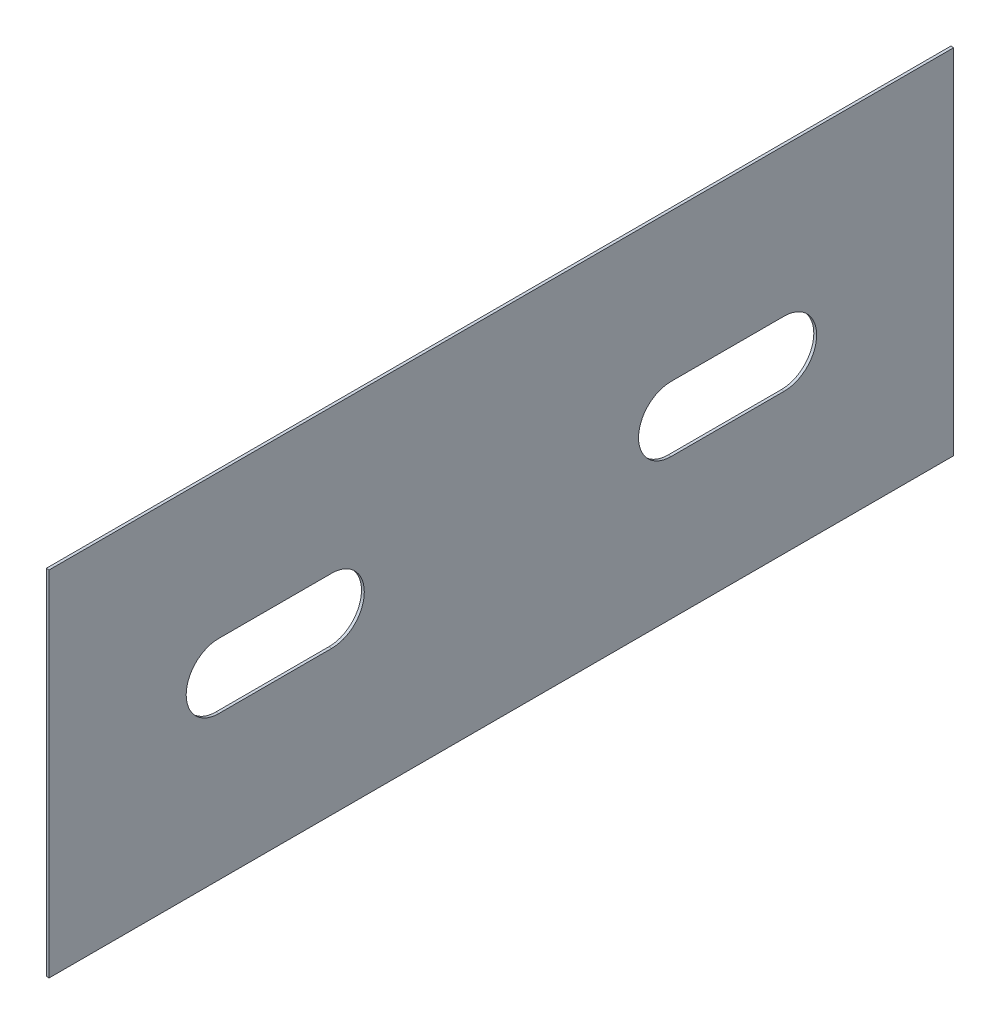
ISO-10303-21;
HEADER;
FILE_DESCRIPTION(('STEP AP214'),'2;1');
FILE_NAME('part.step','',(''),(''),'','','');
FILE_SCHEMA(('AUTOMOTIVE_DESIGN { 1 0 10303 214 1 1 1 1 }'));
ENDSEC;
DATA;
#1=APPLICATION_CONTEXT('core data for automotive mechanical design processes');
#2=APPLICATION_PROTOCOL_DEFINITION('international standard','automotive_design',2000,#1);
#3=PRODUCT_CONTEXT('',#1,'mechanical');
#4=PRODUCT('Part','Part','',(#3));
#5=PRODUCT_RELATED_PRODUCT_CATEGORY('part','',(#4));
#6=PRODUCT_DEFINITION_FORMATION('','',#4);
#7=PRODUCT_DEFINITION_CONTEXT('part definition',#1,'design');
#8=PRODUCT_DEFINITION('design','',#6,#7);
#9=PRODUCT_DEFINITION_SHAPE('','',#8);
#10=(LENGTH_UNIT() NAMED_UNIT(*) SI_UNIT(.MILLI.,.METRE.));
#11=(NAMED_UNIT(*) PLANE_ANGLE_UNIT() SI_UNIT($,.RADIAN.));
#12=(NAMED_UNIT(*) SI_UNIT($,.STERADIAN.) SOLID_ANGLE_UNIT());
#13=UNCERTAINTY_MEASURE_WITH_UNIT(LENGTH_MEASURE(1.E-05),#10,'distance_accuracy_value','');
#14=(GEOMETRIC_REPRESENTATION_CONTEXT(3) GLOBAL_UNCERTAINTY_ASSIGNED_CONTEXT((#13)) GLOBAL_UNIT_ASSIGNED_CONTEXT((#10,
#11,#12)) REPRESENTATION_CONTEXT('',''));
#15=CARTESIAN_POINT('',(0.,0.,0.));
#16=DIRECTION('',(0.,0.,1.));
#17=DIRECTION('',(1.,0.,0.));
#18=AXIS2_PLACEMENT_3D('',#15,#16,#17);
#19=CARTESIAN_POINT('',(2.,0.,0.));
#20=DIRECTION('',(1.,0.,0.));
#21=DIRECTION('',(0.,0.,-1.));
#22=AXIS2_PLACEMENT_3D('',#19,#20,#21);
#23=PLANE('',#22);
#24=DIRECTION('',(0.,-1.,0.));
#25=VECTOR('',#24,1.);
#26=CARTESIAN_POINT('',(2.,135.719844357977,318.75486381323));
#27=LINE('',#26,#25);
#28=CARTESIAN_POINT('',(2.,135.719844357977,318.75486381323));
#29=VERTEX_POINT('',#28);
#30=CARTESIAN_POINT('',(2.,-114.280155642023,318.75486381323));
#31=VERTEX_POINT('',#30);
#32=EDGE_CURVE('E188',#29,#31,#27,.T.);
#33=ORIENTED_EDGE('',*,*,#32,.T.);
#34=DIRECTION('',(0.,0.,-1.));
#35=VECTOR('',#34,1.);
#36=CARTESIAN_POINT('',(2.,-114.280155642023,318.75486381323));
#37=LINE('',#36,#35);
#38=CARTESIAN_POINT('',(2.,-114.280155642023,-321.24513618677));
#39=VERTEX_POINT('',#38);
#40=EDGE_CURVE('E191',#31,#39,#37,.T.);
#41=ORIENTED_EDGE('',*,*,#40,.T.);
#42=DIRECTION('',(0.,1.,0.));
#43=VECTOR('',#42,1.);
#44=CARTESIAN_POINT('',(2.,135.719844357977,-321.24513618677));
#45=LINE('',#44,#43);
#46=CARTESIAN_POINT('',(2.,135.719844357977,-321.24513618677));
#47=VERTEX_POINT('',#46);
#48=EDGE_CURVE('E194',#39,#47,#45,.T.);
#49=ORIENTED_EDGE('',*,*,#48,.T.);
#50=DIRECTION('',(0.,0.,1.));
#51=VECTOR('',#50,1.);
#52=CARTESIAN_POINT('',(2.,135.719844357977,318.75486381323));
#53=LINE('',#52,#51);
#54=EDGE_CURVE('E196',#47,#29,#53,.T.);
#55=ORIENTED_EDGE('',*,*,#54,.T.);
#56=EDGE_LOOP('',(#33,#41,#49,#55));
#57=FACE_BOUND('',#56,.T.);
#58=DIRECTION('',(0.,0.,-1.));
#59=VECTOR('',#58,1.);
#60=CARTESIAN_POINT('',(2.,-12.2801556420232,198.75486381323));
#61=LINE('',#60,#59);
#62=CARTESIAN_POINT('',(2.,-12.2801556420232,198.75486381323));
#63=VERTEX_POINT('',#62);
#64=CARTESIAN_POINT('',(2.,-12.2801556420233,118.75486381323));
#65=VERTEX_POINT('',#64);
#66=EDGE_CURVE('E159',#63,#65,#61,.T.);
#67=ORIENTED_EDGE('',*,*,#66,.F.);
#68=CARTESIAN_POINT('',(2.,10.7198443579767,198.75486381323));
#69=DIRECTION('',(1.,0.,0.));
#70=DIRECTION('',(0.,0.,-1.));
#71=AXIS2_PLACEMENT_3D('',#68,#69,#70);
#72=CIRCLE('',#71,23.);
#73=CARTESIAN_POINT('',(2.,33.7198443579767,198.75486381323));
#74=VERTEX_POINT('',#73);
#75=EDGE_CURVE('E157',#74,#63,#72,.T.);
#76=ORIENTED_EDGE('',*,*,#75,.F.);
#77=DIRECTION('',(0.,0.,1.));
#78=VECTOR('',#77,1.);
#79=CARTESIAN_POINT('',(2.,33.7198443579767,198.75486381323));
#80=LINE('',#79,#78);
#81=CARTESIAN_POINT('',(2.,33.7198443579767,118.75486381323));
#82=VERTEX_POINT('',#81);
#83=EDGE_CURVE('E165',#82,#74,#80,.T.);
#84=ORIENTED_EDGE('',*,*,#83,.F.);
#85=CARTESIAN_POINT('',(2.,10.7198443579767,118.75486381323));
#86=DIRECTION('',(1.,0.,0.));
#87=DIRECTION('',(0.,0.,-1.));
#88=AXIS2_PLACEMENT_3D('',#85,#86,#87);
#89=CIRCLE('',#88,23.);
#90=EDGE_CURVE('E162',#65,#82,#89,.T.);
#91=ORIENTED_EDGE('',*,*,#90,.F.);
#92=EDGE_LOOP('',(#67,#76,#84,#91));
#93=FACE_BOUND('',#92,.T.);
#94=DIRECTION('',(0.,0.,-1.));
#95=VECTOR('',#94,1.);
#96=CARTESIAN_POINT('',(2.,-14.8078155315203,-121.24513618677));
#97=LINE('',#96,#95);
#98=CARTESIAN_POINT('',(2.,-14.8078155315203,-121.24513618677));
#99=VERTEX_POINT('',#98);
#100=CARTESIAN_POINT('',(2.,-14.8078155315203,-201.24513618677));
#101=VERTEX_POINT('',#100);
#102=EDGE_CURVE('E129',#99,#101,#97,.T.);
#103=ORIENTED_EDGE('',*,*,#102,.F.);
#104=CARTESIAN_POINT('',(2.,8.1921844684797,-121.24513618677));
#105=DIRECTION('',(1.,0.,0.));
#106=DIRECTION('',(0.,0.,-1.));
#107=AXIS2_PLACEMENT_3D('',#104,#105,#106);
#108=CIRCLE('',#107,23.);
#109=CARTESIAN_POINT('',(2.,31.1921844684797,-121.24513618677));
#110=VERTEX_POINT('',#109);
#111=EDGE_CURVE('E121',#110,#99,#108,.T.);
#112=ORIENTED_EDGE('',*,*,#111,.F.);
#113=DIRECTION('',(0.,0.,1.));
#114=VECTOR('',#113,1.);
#115=CARTESIAN_POINT('',(2.,31.1921844684797,-121.24513618677));
#116=LINE('',#115,#114);
#117=CARTESIAN_POINT('',(2.,31.1921844684797,-201.24513618677));
#118=VERTEX_POINT('',#117);
#119=EDGE_CURVE('E143',#118,#110,#116,.T.);
#120=ORIENTED_EDGE('',*,*,#119,.F.);
#121=CARTESIAN_POINT('',(2.,8.1921844684797,-201.24513618677));
#122=DIRECTION('',(1.,0.,0.));
#123=DIRECTION('',(0.,0.,-1.));
#124=AXIS2_PLACEMENT_3D('',#121,#122,#123);
#125=CIRCLE('',#124,23.);
#126=EDGE_CURVE('E141',#101,#118,#125,.T.);
#127=ORIENTED_EDGE('',*,*,#126,.F.);
#128=EDGE_LOOP('',(#103,#112,#120,#127));
#129=FACE_BOUND('',#128,.T.);
#130=ADVANCED_FACE('F32',(#57,#93,#129),#23,.T.);
#131=CARTESIAN_POINT('',(0.,0.,0.));
#132=DIRECTION('',(1.,0.,0.));
#133=DIRECTION('',(0.,0.,-1.));
#134=AXIS2_PLACEMENT_3D('',#131,#132,#133);
#135=PLANE('',#134);
#136=CARTESIAN_POINT('',(0.,10.7198443579767,198.75486381323));
#137=DIRECTION('',(1.,0.,0.));
#138=DIRECTION('',(0.,0.,-1.));
#139=AXIS2_PLACEMENT_3D('',#136,#137,#138);
#140=CIRCLE('',#139,23.);
#141=CARTESIAN_POINT('',(0.,33.7198443579767,198.75486381323));
#142=VERTEX_POINT('',#141);
#143=CARTESIAN_POINT('',(0.,-12.2801556420232,198.75486381323));
#144=VERTEX_POINT('',#143);
#145=EDGE_CURVE('E137',#142,#144,#140,.T.);
#146=ORIENTED_EDGE('',*,*,#145,.T.);
#147=DIRECTION('',(0.,0.,-1.));
#148=VECTOR('',#147,1.);
#149=CARTESIAN_POINT('',(0.,-12.2801556420232,198.75486381323));
#150=LINE('',#149,#148);
#151=CARTESIAN_POINT('',(0.,-12.2801556420233,118.75486381323));
#152=VERTEX_POINT('',#151);
#153=EDGE_CURVE('E170',#144,#152,#150,.T.);
#154=ORIENTED_EDGE('',*,*,#153,.T.);
#155=CARTESIAN_POINT('',(0.,10.7198443579767,118.75486381323));
#156=DIRECTION('',(1.,0.,0.));
#157=DIRECTION('',(0.,0.,-1.));
#158=AXIS2_PLACEMENT_3D('',#155,#156,#157);
#159=CIRCLE('',#158,23.);
#160=CARTESIAN_POINT('',(0.,33.7198443579767,118.75486381323));
#161=VERTEX_POINT('',#160);
#162=EDGE_CURVE('E173',#152,#161,#159,.T.);
#163=ORIENTED_EDGE('',*,*,#162,.T.);
#164=DIRECTION('',(0.,0.,1.));
#165=VECTOR('',#164,1.);
#166=CARTESIAN_POINT('',(0.,33.7198443579767,198.75486381323));
#167=LINE('',#166,#165);
#168=EDGE_CURVE('E160',#161,#142,#167,.T.);
#169=ORIENTED_EDGE('',*,*,#168,.T.);
#170=EDGE_LOOP('',(#146,#154,#163,#169));
#171=FACE_BOUND('',#170,.T.);
#172=DIRECTION('',(0.,-1.,0.));
#173=VECTOR('',#172,1.);
#174=CARTESIAN_POINT('',(0.,135.719844357977,318.75486381323));
#175=LINE('',#174,#173);
#176=CARTESIAN_POINT('',(0.,135.719844357977,318.75486381323));
#177=VERTEX_POINT('',#176);
#178=CARTESIAN_POINT('',(0.,-114.280155642023,318.75486381323));
#179=VERTEX_POINT('',#178);
#180=EDGE_CURVE('E187',#177,#179,#175,.T.);
#181=ORIENTED_EDGE('',*,*,#180,.F.);
#182=DIRECTION('',(0.,0.,1.));
#183=VECTOR('',#182,1.);
#184=CARTESIAN_POINT('',(0.,135.719844357977,318.75486381323));
#185=LINE('',#184,#183);
#186=CARTESIAN_POINT('',(0.,135.719844357977,-321.24513618677));
#187=VERTEX_POINT('',#186);
#188=EDGE_CURVE('E192',#187,#177,#185,.T.);
#189=ORIENTED_EDGE('',*,*,#188,.F.);
#190=DIRECTION('',(0.,1.,0.));
#191=VECTOR('',#190,1.);
#192=CARTESIAN_POINT('',(0.,135.719844357977,-321.24513618677));
#193=LINE('',#192,#191);
#194=CARTESIAN_POINT('',(0.,-114.280155642023,-321.24513618677));
#195=VERTEX_POINT('',#194);
#196=EDGE_CURVE('E203',#195,#187,#193,.T.);
#197=ORIENTED_EDGE('',*,*,#196,.F.);
#198=DIRECTION('',(0.,0.,-1.));
#199=VECTOR('',#198,1.);
#200=CARTESIAN_POINT('',(0.,-114.280155642023,318.75486381323));
#201=LINE('',#200,#199);
#202=EDGE_CURVE('E201',#179,#195,#201,.T.);
#203=ORIENTED_EDGE('',*,*,#202,.F.);
#204=EDGE_LOOP('',(#181,#189,#197,#203));
#205=FACE_BOUND('',#204,.T.);
#206=CARTESIAN_POINT('',(0.,8.1921844684797,-121.24513618677));
#207=DIRECTION('',(1.,0.,0.));
#208=DIRECTION('',(0.,0.,-1.));
#209=AXIS2_PLACEMENT_3D('',#206,#207,#208);
#210=CIRCLE('',#209,23.);
#211=CARTESIAN_POINT('',(0.,31.1921844684797,-121.24513618677));
#212=VERTEX_POINT('',#211);
#213=CARTESIAN_POINT('',(0.,-14.8078155315203,-121.24513618677));
#214=VERTEX_POINT('',#213);
#215=EDGE_CURVE('E55',#212,#214,#210,.T.);
#216=ORIENTED_EDGE('',*,*,#215,.T.);
#217=DIRECTION('',(0.,0.,-1.));
#218=VECTOR('',#217,1.);
#219=CARTESIAN_POINT('',(0.,-14.8078155315203,-121.24513618677));
#220=LINE('',#219,#218);
#221=CARTESIAN_POINT('',(0.,-14.8078155315203,-201.24513618677));
#222=VERTEX_POINT('',#221);
#223=EDGE_CURVE('E136',#214,#222,#220,.T.);
#224=ORIENTED_EDGE('',*,*,#223,.T.);
#225=CARTESIAN_POINT('',(0.,8.1921844684797,-201.24513618677));
#226=DIRECTION('',(1.,0.,0.));
#227=DIRECTION('',(0.,0.,-1.));
#228=AXIS2_PLACEMENT_3D('',#225,#226,#227);
#229=CIRCLE('',#228,23.);
#230=CARTESIAN_POINT('',(0.,31.1921844684797,-201.24513618677));
#231=VERTEX_POINT('',#230);
#232=EDGE_CURVE('E149',#222,#231,#229,.T.);
#233=ORIENTED_EDGE('',*,*,#232,.T.);
#234=DIRECTION('',(0.,0.,1.));
#235=VECTOR('',#234,1.);
#236=CARTESIAN_POINT('',(0.,31.1921844684797,-121.24513618677));
#237=LINE('',#236,#235);
#238=EDGE_CURVE('E130',#231,#212,#237,.T.);
#239=ORIENTED_EDGE('',*,*,#238,.T.);
#240=EDGE_LOOP('',(#216,#224,#233,#239));
#241=FACE_BOUND('',#240,.T.);
#242=ADVANCED_FACE('F221',(#171,#205,#241),#135,.F.);
#243=CARTESIAN_POINT('',(2.,135.719844357977,318.75486381323));
#244=DIRECTION('',(0.,0.,-1.));
#245=DIRECTION('',(0.,1.,0.));
#246=AXIS2_PLACEMENT_3D('',#243,#244,#245);
#247=PLANE('',#246);
#248=ORIENTED_EDGE('',*,*,#180,.T.);
#249=DIRECTION('',(-1.,0.,0.));
#250=VECTOR('',#249,1.);
#251=CARTESIAN_POINT('',(2.,-114.280155642023,318.75486381323));
#252=LINE('',#251,#250);
#253=EDGE_CURVE('E11',#31,#179,#252,.T.);
#254=ORIENTED_EDGE('',*,*,#253,.F.);
#255=ORIENTED_EDGE('',*,*,#32,.F.);
#256=DIRECTION('',(-1.,0.,0.));
#257=VECTOR('',#256,1.);
#258=CARTESIAN_POINT('',(2.,135.719844357977,318.75486381323));
#259=LINE('',#258,#257);
#260=EDGE_CURVE('E198',#29,#177,#259,.T.);
#261=ORIENTED_EDGE('',*,*,#260,.T.);
#262=EDGE_LOOP('',(#248,#254,#255,#261));
#263=FACE_BOUND('',#262,.T.);
#264=ADVANCED_FACE('F34',(#263),#247,.F.);
#265=CARTESIAN_POINT('',(2.,-114.280155642023,318.75486381323));
#266=DIRECTION('',(0.,1.,0.));
#267=DIRECTION('',(0.,0.,1.));
#268=AXIS2_PLACEMENT_3D('',#265,#266,#267);
#269=PLANE('',#268);
#270=ORIENTED_EDGE('',*,*,#202,.T.);
#271=DIRECTION('',(-1.,0.,0.));
#272=VECTOR('',#271,1.);
#273=CARTESIAN_POINT('',(2.,-114.280155642023,-321.24513618677));
#274=LINE('',#273,#272);
#275=EDGE_CURVE('E40',#39,#195,#274,.T.);
#276=ORIENTED_EDGE('',*,*,#275,.F.);
#277=ORIENTED_EDGE('',*,*,#40,.F.);
#278=ORIENTED_EDGE('',*,*,#253,.T.);
#279=EDGE_LOOP('',(#270,#276,#277,#278));
#280=FACE_BOUND('',#279,.T.);
#281=ADVANCED_FACE('F232',(#280),#269,.F.);
#282=CARTESIAN_POINT('',(2.,135.719844357977,-321.24513618677));
#283=DIRECTION('',(0.,0.,1.));
#284=DIRECTION('',(1.,0.,0.));
#285=AXIS2_PLACEMENT_3D('',#282,#283,#284);
#286=PLANE('',#285);
#287=ORIENTED_EDGE('',*,*,#196,.T.);
#288=DIRECTION('',(-1.,0.,0.));
#289=VECTOR('',#288,1.);
#290=CARTESIAN_POINT('',(2.,135.719844357977,-321.24513618677));
#291=LINE('',#290,#289);
#292=EDGE_CURVE('E208',#47,#187,#291,.T.);
#293=ORIENTED_EDGE('',*,*,#292,.F.);
#294=ORIENTED_EDGE('',*,*,#48,.F.);
#295=ORIENTED_EDGE('',*,*,#275,.T.);
#296=EDGE_LOOP('',(#287,#293,#294,#295));
#297=FACE_BOUND('',#296,.T.);
#298=ADVANCED_FACE('F215',(#297),#286,.F.);
#299=CARTESIAN_POINT('',(2.,135.719844357977,318.75486381323));
#300=DIRECTION('',(0.,-1.,0.));
#301=DIRECTION('',(0.,0.,-1.));
#302=AXIS2_PLACEMENT_3D('',#299,#300,#301);
#303=PLANE('',#302);
#304=ORIENTED_EDGE('',*,*,#188,.T.);
#305=ORIENTED_EDGE('',*,*,#260,.F.);
#306=ORIENTED_EDGE('',*,*,#54,.F.);
#307=ORIENTED_EDGE('',*,*,#292,.T.);
#308=EDGE_LOOP('',(#304,#305,#306,#307));
#309=FACE_BOUND('',#308,.T.);
#310=ADVANCED_FACE('F225',(#309),#303,.F.);
#311=CARTESIAN_POINT('',(2.,10.7198443579767,198.75486381323));
#312=DIRECTION('',(-1.,0.,0.));
#313=DIRECTION('',(0.,0.,1.));
#314=AXIS2_PLACEMENT_3D('',#311,#312,#313);
#315=CYLINDRICAL_SURFACE('',#314,23.);
#316=ORIENTED_EDGE('',*,*,#145,.F.);
#317=DIRECTION('',(-1.,0.,0.));
#318=VECTOR('',#317,1.);
#319=CARTESIAN_POINT('',(2.,33.7198443579767,198.75486381323));
#320=LINE('',#319,#318);
#321=EDGE_CURVE('E167',#74,#142,#320,.T.);
#322=ORIENTED_EDGE('',*,*,#321,.F.);
#323=ORIENTED_EDGE('',*,*,#75,.T.);
#324=DIRECTION('',(-1.,0.,0.));
#325=VECTOR('',#324,1.);
#326=CARTESIAN_POINT('',(2.,-12.2801556420232,198.75486381323));
#327=LINE('',#326,#325);
#328=EDGE_CURVE('E184',#63,#144,#327,.T.);
#329=ORIENTED_EDGE('',*,*,#328,.T.);
#330=EDGE_LOOP('',(#316,#322,#323,#329));
#331=FACE_BOUND('',#330,.T.);
#332=ADVANCED_FACE('F247',(#331),#315,.F.);
#333=CARTESIAN_POINT('',(2.,-12.2801556420232,198.75486381323));
#334=DIRECTION('',(0.,1.,0.));
#335=DIRECTION('',(0.,0.,1.));
#336=AXIS2_PLACEMENT_3D('',#333,#334,#335);
#337=PLANE('',#336);
#338=ORIENTED_EDGE('',*,*,#153,.F.);
#339=ORIENTED_EDGE('',*,*,#328,.F.);
#340=ORIENTED_EDGE('',*,*,#66,.T.);
#341=DIRECTION('',(-1.,0.,0.));
#342=VECTOR('',#341,1.);
#343=CARTESIAN_POINT('',(2.,-12.2801556420233,118.75486381323));
#344=LINE('',#343,#342);
#345=EDGE_CURVE('E182',#65,#152,#344,.T.);
#346=ORIENTED_EDGE('',*,*,#345,.T.);
#347=EDGE_LOOP('',(#338,#339,#340,#346));
#348=FACE_BOUND('',#347,.T.);
#349=ADVANCED_FACE('F254',(#348),#337,.T.);
#350=CARTESIAN_POINT('',(2.,10.7198443579767,118.75486381323));
#351=DIRECTION('',(-1.,0.,0.));
#352=DIRECTION('',(0.,0.,1.));
#353=AXIS2_PLACEMENT_3D('',#350,#351,#352);
#354=CYLINDRICAL_SURFACE('',#353,23.);
#355=ORIENTED_EDGE('',*,*,#162,.F.);
#356=ORIENTED_EDGE('',*,*,#345,.F.);
#357=ORIENTED_EDGE('',*,*,#90,.T.);
#358=DIRECTION('',(-1.,0.,0.));
#359=VECTOR('',#358,1.);
#360=CARTESIAN_POINT('',(2.,33.7198443579767,118.75486381323));
#361=LINE('',#360,#359);
#362=EDGE_CURVE('E180',#82,#161,#361,.T.);
#363=ORIENTED_EDGE('',*,*,#362,.T.);
#364=EDGE_LOOP('',(#355,#356,#357,#363));
#365=FACE_BOUND('',#364,.T.);
#366=ADVANCED_FACE('F259',(#365),#354,.F.);
#367=CARTESIAN_POINT('',(2.,33.7198443579767,198.75486381323));
#368=DIRECTION('',(0.,-1.,0.));
#369=DIRECTION('',(0.,0.,-1.));
#370=AXIS2_PLACEMENT_3D('',#367,#368,#369);
#371=PLANE('',#370);
#372=ORIENTED_EDGE('',*,*,#168,.F.);
#373=ORIENTED_EDGE('',*,*,#362,.F.);
#374=ORIENTED_EDGE('',*,*,#83,.T.);
#375=ORIENTED_EDGE('',*,*,#321,.T.);
#376=EDGE_LOOP('',(#372,#373,#374,#375));
#377=FACE_BOUND('',#376,.T.);
#378=ADVANCED_FACE('F266',(#377),#371,.T.);
#379=CARTESIAN_POINT('',(2.,8.1921844684797,-121.24513618677));
#380=DIRECTION('',(-1.,0.,0.));
#381=DIRECTION('',(0.,0.,1.));
#382=AXIS2_PLACEMENT_3D('',#379,#380,#381);
#383=CYLINDRICAL_SURFACE('',#382,23.);
#384=ORIENTED_EDGE('',*,*,#215,.F.);
#385=DIRECTION('',(-1.,0.,0.));
#386=VECTOR('',#385,1.);
#387=CARTESIAN_POINT('',(2.,31.1921844684797,-121.24513618677));
#388=LINE('',#387,#386);
#389=EDGE_CURVE('E125',#110,#212,#388,.T.);
#390=ORIENTED_EDGE('',*,*,#389,.F.);
#391=ORIENTED_EDGE('',*,*,#111,.T.);
#392=DIRECTION('',(-1.,0.,0.));
#393=VECTOR('',#392,1.);
#394=CARTESIAN_POINT('',(2.,-14.8078155315203,-121.24513618677));
#395=LINE('',#394,#393);
#396=EDGE_CURVE('E124',#99,#214,#395,.T.);
#397=ORIENTED_EDGE('',*,*,#396,.T.);
#398=EDGE_LOOP('',(#384,#390,#391,#397));
#399=FACE_BOUND('',#398,.T.);
#400=ADVANCED_FACE('F123',(#399),#383,.F.);
#401=CARTESIAN_POINT('',(2.,-14.8078155315203,-121.24513618677));
#402=DIRECTION('',(0.,1.,0.));
#403=DIRECTION('',(0.,0.,1.));
#404=AXIS2_PLACEMENT_3D('',#401,#402,#403);
#405=PLANE('',#404);
#406=ORIENTED_EDGE('',*,*,#223,.F.);
#407=ORIENTED_EDGE('',*,*,#396,.F.);
#408=ORIENTED_EDGE('',*,*,#102,.T.);
#409=DIRECTION('',(-1.,0.,0.));
#410=VECTOR('',#409,1.);
#411=CARTESIAN_POINT('',(2.,-14.8078155315203,-201.24513618677));
#412=LINE('',#411,#410);
#413=EDGE_CURVE('E138',#101,#222,#412,.T.);
#414=ORIENTED_EDGE('',*,*,#413,.T.);
#415=EDGE_LOOP('',(#406,#407,#408,#414));
#416=FACE_BOUND('',#415,.T.);
#417=ADVANCED_FACE('F133',(#416),#405,.T.);
#418=CARTESIAN_POINT('',(2.,8.1921844684797,-201.24513618677));
#419=DIRECTION('',(-1.,0.,0.));
#420=DIRECTION('',(0.,0.,1.));
#421=AXIS2_PLACEMENT_3D('',#418,#419,#420);
#422=CYLINDRICAL_SURFACE('',#421,23.);
#423=ORIENTED_EDGE('',*,*,#232,.F.);
#424=ORIENTED_EDGE('',*,*,#413,.F.);
#425=ORIENTED_EDGE('',*,*,#126,.T.);
#426=DIRECTION('',(-1.,0.,0.));
#427=VECTOR('',#426,1.);
#428=CARTESIAN_POINT('',(2.,31.1921844684797,-201.24513618677));
#429=LINE('',#428,#427);
#430=EDGE_CURVE('E47',#118,#231,#429,.T.);
#431=ORIENTED_EDGE('',*,*,#430,.T.);
#432=EDGE_LOOP('',(#423,#424,#425,#431));
#433=FACE_BOUND('',#432,.T.);
#434=ADVANCED_FACE('F284',(#433),#422,.F.);
#435=CARTESIAN_POINT('',(2.,31.1921844684797,-121.24513618677));
#436=DIRECTION('',(0.,-1.,0.));
#437=DIRECTION('',(0.,0.,-1.));
#438=AXIS2_PLACEMENT_3D('',#435,#436,#437);
#439=PLANE('',#438);
#440=ORIENTED_EDGE('',*,*,#238,.F.);
#441=ORIENTED_EDGE('',*,*,#430,.F.);
#442=ORIENTED_EDGE('',*,*,#119,.T.);
#443=ORIENTED_EDGE('',*,*,#389,.T.);
#444=EDGE_LOOP('',(#440,#441,#442,#443));
#445=FACE_BOUND('',#444,.T.);
#446=ADVANCED_FACE('F287',(#445),#439,.T.);
#447=CLOSED_SHELL('',(#130,#242,#264,#281,#298,#310,#332,#349,#366,#378,#400,#417,#434,#446));
#448=MANIFOLD_SOLID_BREP('B2',#447);
#449=ADVANCED_BREP_SHAPE_REPRESENTATION('',(#18,#448),#14);
#450=SHAPE_DEFINITION_REPRESENTATION(#9,#449);
ENDSEC;
END-ISO-10303-21;
